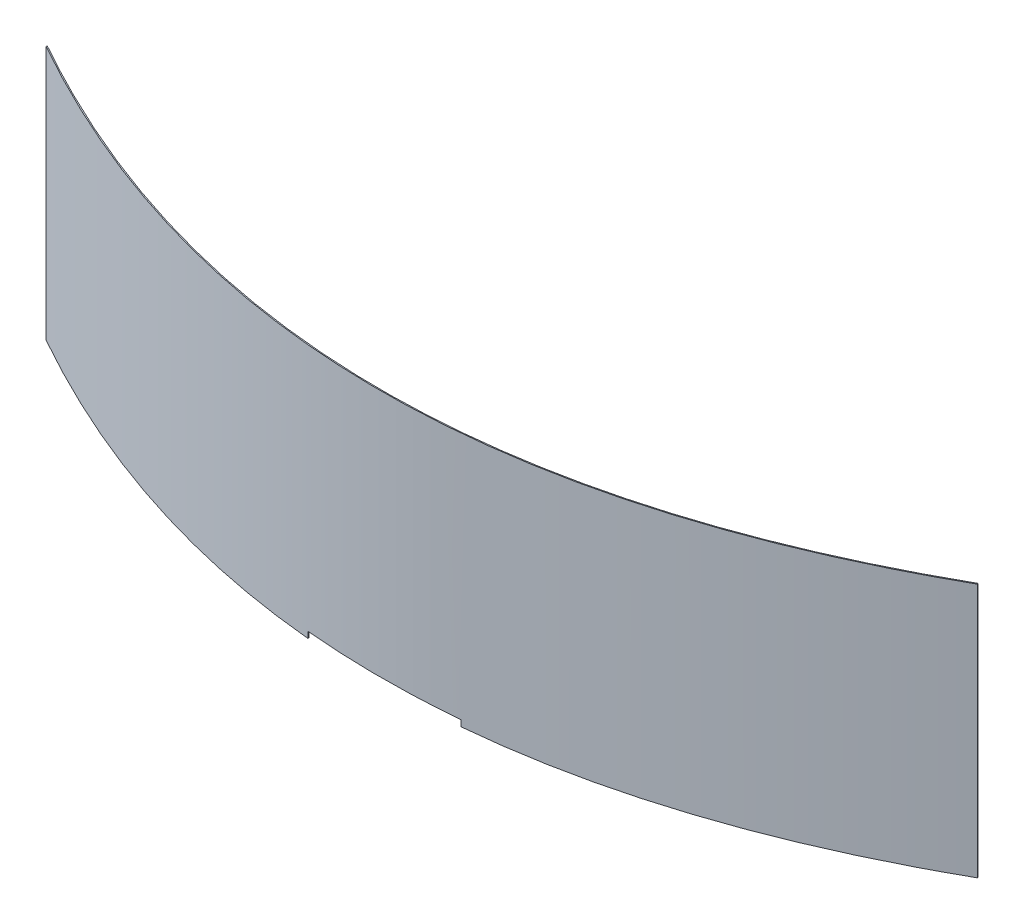
ISO-10303-21;
HEADER;
FILE_DESCRIPTION(('STEP AP214'),'2;1');
FILE_NAME('part.step','',(''),(''),'','','');
FILE_SCHEMA(('AUTOMOTIVE_DESIGN { 1 0 10303 214 1 1 1 1 }'));
ENDSEC;
DATA;
#1=APPLICATION_CONTEXT('core data for automotive mechanical design processes');
#2=APPLICATION_PROTOCOL_DEFINITION('international standard','automotive_design',2000,#1);
#3=PRODUCT_CONTEXT('',#1,'mechanical');
#4=PRODUCT('Part','Part','',(#3));
#5=PRODUCT_RELATED_PRODUCT_CATEGORY('part','',(#4));
#6=PRODUCT_DEFINITION_FORMATION('','',#4);
#7=PRODUCT_DEFINITION_CONTEXT('part definition',#1,'design');
#8=PRODUCT_DEFINITION('design','',#6,#7);
#9=PRODUCT_DEFINITION_SHAPE('','',#8);
#10=(LENGTH_UNIT() NAMED_UNIT(*) SI_UNIT(.MILLI.,.METRE.));
#11=(NAMED_UNIT(*) PLANE_ANGLE_UNIT() SI_UNIT($,.RADIAN.));
#12=(NAMED_UNIT(*) SI_UNIT($,.STERADIAN.) SOLID_ANGLE_UNIT());
#13=UNCERTAINTY_MEASURE_WITH_UNIT(LENGTH_MEASURE(1.E-05),#10,'distance_accuracy_value','');
#14=(GEOMETRIC_REPRESENTATION_CONTEXT(3) GLOBAL_UNCERTAINTY_ASSIGNED_CONTEXT((#13)) GLOBAL_UNIT_ASSIGNED_CONTEXT((#10,
#11,#12)) REPRESENTATION_CONTEXT('',''));
#15=CARTESIAN_POINT('',(0.,0.,0.));
#16=DIRECTION('',(0.,0.,1.));
#17=DIRECTION('',(1.,0.,0.));
#18=AXIS2_PLACEMENT_3D('',#15,#16,#17);
#19=CARTESIAN_POINT('',(28284.2712474619,123.,-999800.));
#20=CARTESIAN_POINT('',(0.,123.,1000200.));
#21=CARTESIAN_POINT('',(-28284.2712474619,123.,-999800.));
#22=B_SPLINE_CURVE_WITH_KNOTS('',2,(#19,#20,#21),.UNSPECIFIED.,.F.,.F.,(3,3),(0.,1.),.UNSPECIFIED.);
#23=DIRECTION('',(0.,-1.,0.));
#24=VECTOR('',#23,1.);
#25=SURFACE_OF_LINEAR_EXTRUSION('',#22,#24);
#26=DIRECTION('',(0.,-1.,0.));
#27=VECTOR('',#26,1.);
#28=CARTESIAN_POINT('',(-36.9999999999981,123.,198.288749999989));
#29=LINE('',#28,#27);
#30=CARTESIAN_POINT('',(-37.,0.,198.288749999989));
#31=VERTEX_POINT('',#30);
#32=CARTESIAN_POINT('',(-37.,3.00000000000002,198.288749999989));
#33=VERTEX_POINT('',#32);
#34=EDGE_CURVE('E176',#31,#33,#29,.F.);
#35=ORIENTED_EDGE('',*,*,#34,.F.);
#36=CARTESIAN_POINT('',(28284.2712474619,0.,-999800.));
#37=CARTESIAN_POINT('',(0.,0.,1000200.));
#38=CARTESIAN_POINT('',(-28284.2712474619,0.,-999800.));
#39=B_SPLINE_CURVE_WITH_KNOTS('',2,(#36,#37,#38),.UNSPECIFIED.,.F.,.F.,(3,3),(0.,1.),.UNSPECIFIED.);
#40=CARTESIAN_POINT('',(-225.000000000003,0.,136.718749999988));
#41=VERTEX_POINT('',#40);
#42=EDGE_CURVE('E165',#31,#41,#39,.T.);
#43=ORIENTED_EDGE('',*,*,#42,.T.);
#44=DIRECTION('',(0.,-1.,0.));
#45=VECTOR('',#44,1.);
#46=CARTESIAN_POINT('',(-225.000000000003,123.,136.718749999988));
#47=LINE('',#46,#45);
#48=CARTESIAN_POINT('',(-225.000000000003,123.,136.718749999988));
#49=VERTEX_POINT('',#48);
#50=EDGE_CURVE('E11',#49,#41,#47,.T.);
#51=ORIENTED_EDGE('',*,*,#50,.F.);
#52=CARTESIAN_POINT('',(224.999999999997,123.,136.718749999988));
#53=VERTEX_POINT('',#52);
#54=EDGE_CURVE('E152',#53,#49,#22,.T.);
#55=ORIENTED_EDGE('',*,*,#54,.F.);
#56=DIRECTION('',(0.,-1.,0.));
#57=VECTOR('',#56,1.);
#58=CARTESIAN_POINT('',(224.999999999997,123.,136.718749999988));
#59=LINE('',#58,#57);
#60=CARTESIAN_POINT('',(224.999999999997,0.,136.718749999988));
#61=VERTEX_POINT('',#60);
#62=EDGE_CURVE('E153',#53,#61,#59,.T.);
#63=ORIENTED_EDGE('',*,*,#62,.T.);
#64=CARTESIAN_POINT('',(36.9999999999999,0.,198.288749999989));
#65=VERTEX_POINT('',#64);
#66=EDGE_CURVE('E142',#61,#65,#39,.T.);
#67=ORIENTED_EDGE('',*,*,#66,.T.);
#68=DIRECTION('',(0.,-1.,0.));
#69=VECTOR('',#68,1.);
#70=CARTESIAN_POINT('',(37.0000000000035,123.,198.288749999988));
#71=LINE('',#70,#69);
#72=CARTESIAN_POINT('',(37.,3.00000000000003,198.288749999988));
#73=VERTEX_POINT('',#72);
#74=EDGE_CURVE('E61',#73,#65,#71,.T.);
#75=ORIENTED_EDGE('',*,*,#74,.F.);
#76=CARTESIAN_POINT('',(28284.2712474619,3.00000000000003,-999800.));
#77=CARTESIAN_POINT('',(0.,3.00000000000003,1000200.));
#78=CARTESIAN_POINT('',(-28284.2712474619,3.00000000000003,-999800.));
#79=B_SPLINE_CURVE_WITH_KNOTS('',2,(#76,#77,#78),.UNSPECIFIED.,.F.,.F.,(3,3),(0.,1.),.UNSPECIFIED.);
#80=EDGE_CURVE('E178',#33,#73,#79,.F.);
#81=ORIENTED_EDGE('',*,*,#80,.F.);
#82=EDGE_LOOP('',(#35,#43,#51,#55,#63,#67,#75,#81));
#83=FACE_BOUND('',#82,.T.);
#84=ADVANCED_FACE('F46',(#83),#25,.F.);
#85=CARTESIAN_POINT('',(-225.245130619819,123.,137.154537768551));
#86=CARTESIAN_POINT('',(-222.908176032963,123.,138.469074723657));
#87=CARTESIAN_POINT('',(-218.204067638301,123.,141.073902870022));
#88=CARTESIAN_POINT('',(-208.827276173067,123.,146.100944940152));
#89=CARTESIAN_POINT('',(-197.095113633908,123.,152.081763048424));
#90=CARTESIAN_POINT('',(-183.020628450954,123.,158.761564513527));
#91=CARTESIAN_POINT('',(-164.252323786066,123.,167.009400213228));
#92=CARTESIAN_POINT('',(-140.791197461168,123.,176.082259845335));
#93=CARTESIAN_POINT('',(-112.635650998168,123.,184.990896120192));
#94=CARTESIAN_POINT('',(-84.4784352769144,123.,191.920233494286));
#95=CARTESIAN_POINT('',(-46.9335816501066,123.,198.519950199364));
#96=CARTESIAN_POINT('',(-3.53883589099269E-13,123.,201.820033200405));
#97=CARTESIAN_POINT('',(46.9335816501035,123.,198.519950199365));
#98=CARTESIAN_POINT('',(84.4784352769108,123.,191.920233494286));
#99=CARTESIAN_POINT('',(112.635650998168,123.,184.990896120193));
#100=CARTESIAN_POINT('',(140.791197461162,123.,176.082259845337));
#101=CARTESIAN_POINT('',(164.252323786063,123.,167.009400213228));
#102=CARTESIAN_POINT('',(183.020628450953,123.,158.761564513527));
#103=CARTESIAN_POINT('',(197.0951136339,123.,152.081763048426));
#104=CARTESIAN_POINT('',(208.827276173062,123.,146.100944940152));
#105=CARTESIAN_POINT('',(218.204067638298,123.,141.073902870023));
#106=CARTESIAN_POINT('',(222.90817603296,123.,138.469074723659));
#107=CARTESIAN_POINT('',(225.245130619814,123.,137.154537768553));
#108=B_SPLINE_CURVE_WITH_KNOTS('',3,(#85,#86,#87,#88,#89,#90,#91,#92,#93,#94,#95,#96,#97,#98,
#99,#100,#101,#102,#103,#104,#105,#106,#107),.UNSPECIFIED.,.F.,.F.,(4,1,1,1,1,1,1,1,1,1,1,1,1,1,
1,1,1,1,1,1,4),(0.496022524355826,0.496146820469706,0.496271116583587,0.496519708811347,
0.496768301039108,0.497016893266869,0.497514077722391,0.498011262177913,0.498508446633435,
0.499005631088956,0.5,0.500994368911044,0.501491553366565,0.501988737822087,0.502485922277609,
0.502983106733131,0.503231698960892,0.503480291188652,0.503728883416413,0.503853179530294,
0.503977475644174),.UNSPECIFIED.);
#109=DIRECTION('',(0.,-1.,0.));
#110=VECTOR('',#109,1.);
#111=SURFACE_OF_LINEAR_EXTRUSION('',#108,#110);
#112=DIRECTION('',(0.,-1.,0.));
#113=VECTOR('',#112,1.);
#114=CARTESIAN_POINT('',(-37.0000000000017,123.,198.790876905931));
#115=LINE('',#114,#113);
#116=CARTESIAN_POINT('',(-37.,0.,198.790876905773));
#117=VERTEX_POINT('',#116);
#118=CARTESIAN_POINT('',(-37.0000000000017,3.00000000000003,198.790876905931));
#119=VERTEX_POINT('',#118);
#120=EDGE_CURVE('E221',#117,#119,#115,.F.);
#121=ORIENTED_EDGE('',*,*,#120,.T.);
#122=CARTESIAN_POINT('',(-225.245130619819,3.00000000000003,137.154537768551));
#123=CARTESIAN_POINT('',(-222.908176032963,3.00000000000003,138.469074723657));
#124=CARTESIAN_POINT('',(-218.204067638301,3.00000000000003,141.073902870022));
#125=CARTESIAN_POINT('',(-208.827276173067,3.00000000000003,146.100944940152));
#126=CARTESIAN_POINT('',(-197.095113633908,3.00000000000003,152.081763048424));
#127=CARTESIAN_POINT('',(-183.020628450954,3.00000000000003,158.761564513527));
#128=CARTESIAN_POINT('',(-164.252323786066,3.00000000000003,167.009400213228));
#129=CARTESIAN_POINT('',(-140.791197461168,3.00000000000003,176.082259845335));
#130=CARTESIAN_POINT('',(-112.635650998168,3.00000000000003,184.990896120192));
#131=CARTESIAN_POINT('',(-84.4784352769144,3.00000000000003,191.920233494286));
#132=CARTESIAN_POINT('',(-46.9335816501066,3.00000000000003,198.519950199364));
#133=CARTESIAN_POINT('',(-3.53883589099269E-13,3.00000000000003,201.820033200405));
#134=CARTESIAN_POINT('',(46.9335816501035,3.00000000000003,198.519950199365));
#135=CARTESIAN_POINT('',(84.4784352769108,3.00000000000003,191.920233494286));
#136=CARTESIAN_POINT('',(112.635650998168,3.00000000000003,184.990896120193));
#137=CARTESIAN_POINT('',(140.791197461162,3.00000000000003,176.082259845337));
#138=CARTESIAN_POINT('',(164.252323786063,3.00000000000003,167.009400213228));
#139=CARTESIAN_POINT('',(183.020628450953,3.00000000000003,158.761564513527));
#140=CARTESIAN_POINT('',(197.0951136339,3.00000000000003,152.081763048426));
#141=CARTESIAN_POINT('',(208.827276173062,3.00000000000003,146.100944940152));
#142=CARTESIAN_POINT('',(218.204067638298,3.00000000000003,141.073902870023));
#143=CARTESIAN_POINT('',(222.90817603296,3.00000000000003,138.469074723659));
#144=CARTESIAN_POINT('',(225.245130619814,3.00000000000003,137.154537768553));
#145=B_SPLINE_CURVE_WITH_KNOTS('',3,(#122,#123,#124,#125,#126,#127,#128,#129,#130,#131,#132,
#133,#134,#135,#136,#137,#138,#139,#140,#141,#142,#143,#144),.UNSPECIFIED.,.F.,.F.,(4,1,1,1,1,1,
1,1,1,1,1,1,1,1,1,1,1,1,1,1,4),(0.496022524355826,0.496146820469706,0.496271116583587,
0.496519708811347,0.496768301039108,0.497016893266869,0.497514077722391,0.498011262177913,
0.498508446633435,0.499005631088956,0.5,0.500994368911044,0.501491553366565,0.501988737822087,
0.502485922277609,0.502983106733131,0.503231698960892,0.503480291188652,0.503728883416413,
0.503853179530294,0.503977475644174),.UNSPECIFIED.);
#146=CARTESIAN_POINT('',(37.0000000000007,3.00000000000003,198.790876905932));
#147=VERTEX_POINT('',#146);
#148=EDGE_CURVE('E135',#119,#147,#145,.T.);
#149=ORIENTED_EDGE('',*,*,#148,.T.);
#150=DIRECTION('',(0.,-1.,0.));
#151=VECTOR('',#150,1.);
#152=CARTESIAN_POINT('',(37.0000000000007,123.,198.790876905932));
#153=LINE('',#152,#151);
#154=CARTESIAN_POINT('',(36.9999999999944,0.,198.790876905932));
#155=VERTEX_POINT('',#154);
#156=EDGE_CURVE('E121',#147,#155,#153,.T.);
#157=ORIENTED_EDGE('',*,*,#156,.T.);
#158=CARTESIAN_POINT('',(-225.245130619819,0.,137.154537768551));
#159=CARTESIAN_POINT('',(-222.908176032963,0.,138.469074723657));
#160=CARTESIAN_POINT('',(-218.204067638301,0.,141.073902870022));
#161=CARTESIAN_POINT('',(-208.827276173067,0.,146.100944940152));
#162=CARTESIAN_POINT('',(-197.095113633908,0.,152.081763048424));
#163=CARTESIAN_POINT('',(-183.020628450954,0.,158.761564513527));
#164=CARTESIAN_POINT('',(-164.252323786066,0.,167.009400213228));
#165=CARTESIAN_POINT('',(-140.791197461168,0.,176.082259845335));
#166=CARTESIAN_POINT('',(-112.635650998168,0.,184.990896120192));
#167=CARTESIAN_POINT('',(-84.4784352769144,0.,191.920233494286));
#168=CARTESIAN_POINT('',(-46.9335816501066,0.,198.519950199364));
#169=CARTESIAN_POINT('',(-3.53883589099269E-13,0.,201.820033200405));
#170=CARTESIAN_POINT('',(46.9335816501035,0.,198.519950199365));
#171=CARTESIAN_POINT('',(84.4784352769108,0.,191.920233494286));
#172=CARTESIAN_POINT('',(112.635650998168,0.,184.990896120193));
#173=CARTESIAN_POINT('',(140.791197461162,0.,176.082259845337));
#174=CARTESIAN_POINT('',(164.252323786063,0.,167.009400213228));
#175=CARTESIAN_POINT('',(183.020628450953,0.,158.761564513527));
#176=CARTESIAN_POINT('',(197.0951136339,0.,152.081763048426));
#177=CARTESIAN_POINT('',(208.827276173062,0.,146.100944940152));
#178=CARTESIAN_POINT('',(218.204067638298,0.,141.073902870023));
#179=CARTESIAN_POINT('',(222.90817603296,0.,138.469074723659));
#180=CARTESIAN_POINT('',(225.245130619814,0.,137.154537768553));
#181=B_SPLINE_CURVE_WITH_KNOTS('',3,(#158,#159,#160,#161,#162,#163,#164,#165,#166,#167,#168,
#169,#170,#171,#172,#173,#174,#175,#176,#177,#178,#179,#180),.UNSPECIFIED.,.F.,.F.,(4,1,1,1,1,1,
1,1,1,1,1,1,1,1,1,1,1,1,1,1,4),(0.496022524355826,0.496146820469706,0.496271116583587,
0.496519708811347,0.496768301039108,0.497016893266869,0.497514077722391,0.498011262177913,
0.498508446633435,0.499005631088956,0.5,0.500994368911044,0.501491553366565,0.501988737822087,
0.502485922277609,0.502983106733131,0.503231698960892,0.503480291188652,0.503728883416413,
0.503853179530294,0.503977475644174),.UNSPECIFIED.);
#182=CARTESIAN_POINT('',(225.245130619814,0.,137.154537768553));
#183=VERTEX_POINT('',#182);
#184=EDGE_CURVE('E134',#155,#183,#181,.T.);
#185=ORIENTED_EDGE('',*,*,#184,.T.);
#186=DIRECTION('',(0.,-1.,0.));
#187=VECTOR('',#186,1.);
#188=CARTESIAN_POINT('',(225.245130619814,123.,137.154537768553));
#189=LINE('',#188,#187);
#190=CARTESIAN_POINT('',(225.245130619814,123.,137.154537768553));
#191=VERTEX_POINT('',#190);
#192=EDGE_CURVE('E155',#191,#183,#189,.T.);
#193=ORIENTED_EDGE('',*,*,#192,.F.);
#194=CARTESIAN_POINT('',(-225.245130619819,123.,137.154537768551));
#195=VERTEX_POINT('',#194);
#196=EDGE_CURVE('E159',#195,#191,#108,.T.);
#197=ORIENTED_EDGE('',*,*,#196,.F.);
#198=DIRECTION('',(0.,-1.,0.));
#199=VECTOR('',#198,1.);
#200=CARTESIAN_POINT('',(-225.245130619819,123.,137.154537768551));
#201=LINE('',#200,#199);
#202=CARTESIAN_POINT('',(-225.245130619819,0.,137.154537768551));
#203=VERTEX_POINT('',#202);
#204=EDGE_CURVE('E54',#195,#203,#201,.T.);
#205=ORIENTED_EDGE('',*,*,#204,.T.);
#206=EDGE_CURVE('E138',#203,#117,#181,.T.);
#207=ORIENTED_EDGE('',*,*,#206,.T.);
#208=EDGE_LOOP('',(#121,#149,#157,#185,#193,#197,#205,#207));
#209=FACE_BOUND('',#208,.T.);
#210=ADVANCED_FACE('F132',(#209),#111,.F.);
#211=CARTESIAN_POINT('',(0.,0.,199.999999999989));
#212=DIRECTION('',(0.,-1.,0.));
#213=DIRECTION('',(0.,0.,-1.));
#214=AXIS2_PLACEMENT_3D('',#211,#212,#213);
#215=PLANE('',#214);
#216=ORIENTED_EDGE('',*,*,#42,.F.);
#217=DIRECTION('',(0.,0.,-1.));
#218=VECTOR('',#217,1.);
#219=CARTESIAN_POINT('',(-37.,0.,201.821033200405));
#220=LINE('',#219,#218);
#221=EDGE_CURVE('E127',#117,#31,#220,.T.);
#222=ORIENTED_EDGE('',*,*,#221,.F.);
#223=ORIENTED_EDGE('',*,*,#206,.F.);
#224=DIRECTION('',(-0.490261239632588,0.,0.871575537124533));
#225=VECTOR('',#224,1.);
#226=CARTESIAN_POINT('',(-225.000000000003,0.,136.718749999988));
#227=LINE('',#226,#225);
#228=EDGE_CURVE('E139',#41,#203,#227,.T.);
#229=ORIENTED_EDGE('',*,*,#228,.F.);
#230=EDGE_LOOP('',(#216,#222,#223,#229));
#231=FACE_BOUND('',#230,.T.);
#232=ADVANCED_FACE('F164',(#231),#215,.T.);
#233=ORIENTED_EDGE('',*,*,#184,.F.);
#234=DIRECTION('',(0.,0.,-1.));
#235=VECTOR('',#234,1.);
#236=CARTESIAN_POINT('',(37.,0.,201.821033200405));
#237=LINE('',#236,#235);
#238=EDGE_CURVE('E118',#155,#65,#237,.T.);
#239=ORIENTED_EDGE('',*,*,#238,.T.);
#240=ORIENTED_EDGE('',*,*,#66,.F.);
#241=DIRECTION('',(-0.490261239632251,0.,-0.871575537124723));
#242=VECTOR('',#241,1.);
#243=CARTESIAN_POINT('',(225.245130619814,0.,137.154537768553));
#244=LINE('',#243,#242);
#245=EDGE_CURVE('E91',#183,#61,#244,.T.);
#246=ORIENTED_EDGE('',*,*,#245,.F.);
#247=EDGE_LOOP('',(#233,#239,#240,#246));
#248=FACE_BOUND('',#247,.T.);
#249=ADVANCED_FACE('F137',(#248),#215,.T.);
#250=CARTESIAN_POINT('',(-225.000000000003,123.,136.718749999988));
#251=DIRECTION('',(0.871575537124533,0.,0.490261239632588));
#252=DIRECTION('',(0.490261239632588,0.,-0.871575537124533));
#253=AXIS2_PLACEMENT_3D('',#250,#251,#252);
#254=PLANE('',#253);
#255=ORIENTED_EDGE('',*,*,#228,.T.);
#256=ORIENTED_EDGE('',*,*,#204,.F.);
#257=DIRECTION('',(-0.490261239632588,0.,0.871575537124533));
#258=VECTOR('',#257,1.);
#259=CARTESIAN_POINT('',(-225.000000000003,123.,136.718749999988));
#260=LINE('',#259,#258);
#261=EDGE_CURVE('E98',#49,#195,#260,.T.);
#262=ORIENTED_EDGE('',*,*,#261,.F.);
#263=ORIENTED_EDGE('',*,*,#50,.T.);
#264=EDGE_LOOP('',(#255,#256,#262,#263));
#265=FACE_BOUND('',#264,.T.);
#266=ADVANCED_FACE('F204',(#265),#254,.F.);
#267=CARTESIAN_POINT('',(225.245130619814,123.,137.154537768553));
#268=DIRECTION('',(-0.871575537124723,0.,0.490261239632251));
#269=DIRECTION('',(0.490261239632251,0.,0.871575537124723));
#270=AXIS2_PLACEMENT_3D('',#267,#268,#269);
#271=PLANE('',#270);
#272=ORIENTED_EDGE('',*,*,#245,.T.);
#273=ORIENTED_EDGE('',*,*,#62,.F.);
#274=DIRECTION('',(-0.490261239632251,0.,-0.871575537124723));
#275=VECTOR('',#274,1.);
#276=CARTESIAN_POINT('',(225.245130619814,123.,137.154537768553));
#277=LINE('',#276,#275);
#278=EDGE_CURVE('E70',#191,#53,#277,.T.);
#279=ORIENTED_EDGE('',*,*,#278,.F.);
#280=ORIENTED_EDGE('',*,*,#192,.T.);
#281=EDGE_LOOP('',(#272,#273,#279,#280));
#282=FACE_BOUND('',#281,.T.);
#283=ADVANCED_FACE('F202',(#282),#271,.F.);
#284=CARTESIAN_POINT('',(0.,123.,199.999999999989));
#285=DIRECTION('',(0.,-1.,0.));
#286=DIRECTION('',(0.,0.,-1.));
#287=AXIS2_PLACEMENT_3D('',#284,#285,#286);
#288=PLANE('',#287);
#289=ORIENTED_EDGE('',*,*,#54,.T.);
#290=ORIENTED_EDGE('',*,*,#261,.T.);
#291=ORIENTED_EDGE('',*,*,#196,.T.);
#292=ORIENTED_EDGE('',*,*,#278,.T.);
#293=EDGE_LOOP('',(#289,#290,#291,#292));
#294=FACE_BOUND('',#293,.T.);
#295=ADVANCED_FACE('F210',(#294),#288,.F.);
#296=CARTESIAN_POINT('',(37.,3.00000000000003,201.821033200405));
#297=DIRECTION('',(0.,-1.,0.));
#298=DIRECTION('',(1.,0.,0.));
#299=AXIS2_PLACEMENT_3D('',#296,#297,#298);
#300=PLANE('',#299);
#301=ORIENTED_EDGE('',*,*,#80,.T.);
#302=DIRECTION('',(0.,0.,-1.));
#303=VECTOR('',#302,1.);
#304=CARTESIAN_POINT('',(37.,3.00000000000003,201.821033200405));
#305=LINE('',#304,#303);
#306=EDGE_CURVE('E171',#147,#73,#305,.T.);
#307=ORIENTED_EDGE('',*,*,#306,.F.);
#308=ORIENTED_EDGE('',*,*,#148,.F.);
#309=DIRECTION('',(0.,0.,-1.));
#310=VECTOR('',#309,1.);
#311=CARTESIAN_POINT('',(-37.,3.00000000000002,201.821033200405));
#312=LINE('',#311,#310);
#313=EDGE_CURVE('E168',#119,#33,#312,.T.);
#314=ORIENTED_EDGE('',*,*,#313,.T.);
#315=EDGE_LOOP('',(#301,#307,#308,#314));
#316=FACE_BOUND('',#315,.T.);
#317=ADVANCED_FACE('F220',(#316),#300,.T.);
#318=CARTESIAN_POINT('',(-37.,3.00000000000002,201.821033200405));
#319=DIRECTION('',(1.,0.,0.));
#320=DIRECTION('',(0.,1.,0.));
#321=AXIS2_PLACEMENT_3D('',#318,#319,#320);
#322=PLANE('',#321);
#323=ORIENTED_EDGE('',*,*,#34,.T.);
#324=ORIENTED_EDGE('',*,*,#313,.F.);
#325=ORIENTED_EDGE('',*,*,#120,.F.);
#326=ORIENTED_EDGE('',*,*,#221,.T.);
#327=EDGE_LOOP('',(#323,#324,#325,#326));
#328=FACE_BOUND('',#327,.T.);
#329=ADVANCED_FACE('F218',(#328),#322,.T.);
#330=CARTESIAN_POINT('',(37.,3.00000000000003,201.821033200405));
#331=DIRECTION('',(-1.,0.,0.));
#332=DIRECTION('',(0.,-1.,0.));
#333=AXIS2_PLACEMENT_3D('',#330,#331,#332);
#334=PLANE('',#333);
#335=ORIENTED_EDGE('',*,*,#74,.T.);
#336=ORIENTED_EDGE('',*,*,#238,.F.);
#337=ORIENTED_EDGE('',*,*,#156,.F.);
#338=ORIENTED_EDGE('',*,*,#306,.T.);
#339=EDGE_LOOP('',(#335,#336,#337,#338));
#340=FACE_BOUND('',#339,.T.);
#341=ADVANCED_FACE('F120',(#340),#334,.T.);
#342=CLOSED_SHELL('',(#84,#210,#232,#249,#266,#283,#295,#317,#329,#341));
#343=MANIFOLD_SOLID_BREP('B2',#342);
#344=ADVANCED_BREP_SHAPE_REPRESENTATION('',(#18,#343),#14);
#345=SHAPE_DEFINITION_REPRESENTATION(#9,#344);
ENDSEC;
END-ISO-10303-21;
